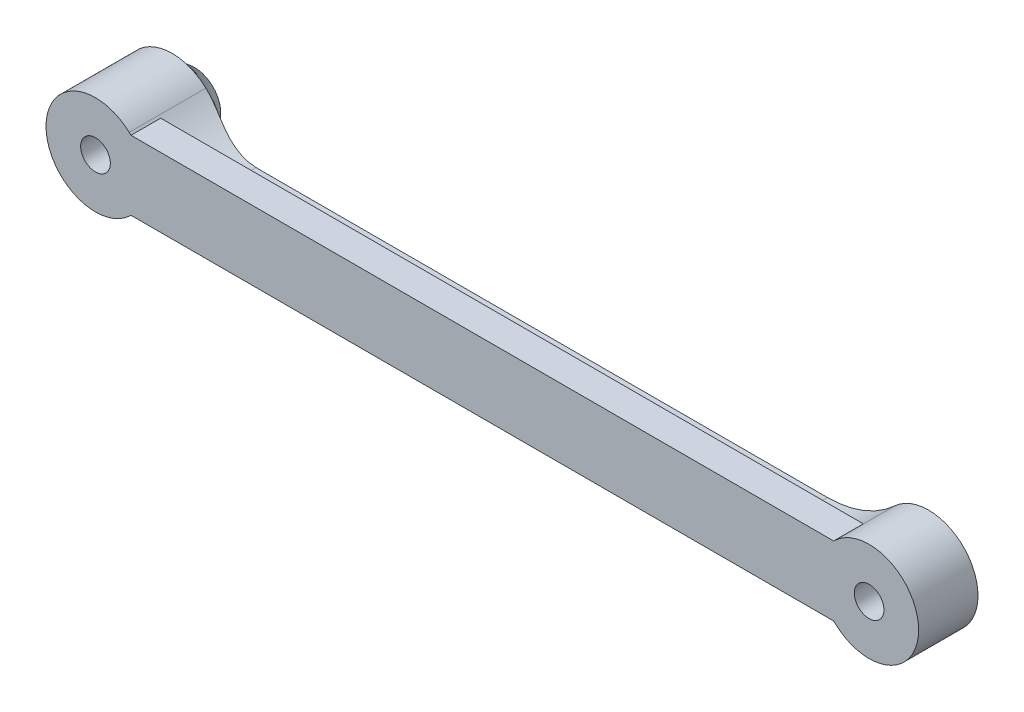
ISO-10303-21;
HEADER;
FILE_DESCRIPTION(('STEP AP214'),'2;1');
FILE_NAME('part.step','',(''),(''),'','','');
FILE_SCHEMA(('AUTOMOTIVE_DESIGN { 1 0 10303 214 1 1 1 1 }'));
ENDSEC;
DATA;
#1=APPLICATION_CONTEXT('core data for automotive mechanical design processes');
#2=APPLICATION_PROTOCOL_DEFINITION('international standard','automotive_design',2000,#1);
#3=PRODUCT_CONTEXT('',#1,'mechanical');
#4=PRODUCT('Part','Part','',(#3));
#5=PRODUCT_RELATED_PRODUCT_CATEGORY('part','',(#4));
#6=PRODUCT_DEFINITION_FORMATION('','',#4);
#7=PRODUCT_DEFINITION_CONTEXT('part definition',#1,'design');
#8=PRODUCT_DEFINITION('design','',#6,#7);
#9=PRODUCT_DEFINITION_SHAPE('','',#8);
#10=(LENGTH_UNIT() NAMED_UNIT(*) SI_UNIT(.MILLI.,.METRE.));
#11=(NAMED_UNIT(*) PLANE_ANGLE_UNIT() SI_UNIT($,.RADIAN.));
#12=(NAMED_UNIT(*) SI_UNIT($,.STERADIAN.) SOLID_ANGLE_UNIT());
#13=UNCERTAINTY_MEASURE_WITH_UNIT(LENGTH_MEASURE(1.E-05),#10,'distance_accuracy_value','');
#14=(GEOMETRIC_REPRESENTATION_CONTEXT(3) GLOBAL_UNCERTAINTY_ASSIGNED_CONTEXT((#13)) GLOBAL_UNIT_ASSIGNED_CONTEXT((#10,
#11,#12)) REPRESENTATION_CONTEXT('',''));
#15=CARTESIAN_POINT('',(0.,0.,0.));
#16=DIRECTION('',(0.,0.,1.));
#17=DIRECTION('',(1.,0.,0.));
#18=AXIS2_PLACEMENT_3D('',#15,#16,#17);
#19=CARTESIAN_POINT('',(78.1410447986133,0.,3.));
#20=DIRECTION('',(0.,0.,-1.));
#21=DIRECTION('',(-1.,0.,0.));
#22=AXIS2_PLACEMENT_3D('',#19,#20,#21);
#23=CYLINDRICAL_SURFACE('',#22,5.);
#24=CARTESIAN_POINT('',(78.1410447986133,0.,-3.));
#25=DIRECTION('',(0.,0.,1.));
#26=DIRECTION('',(1.,0.,0.));
#27=AXIS2_PLACEMENT_3D('',#24,#25,#26);
#28=CIRCLE('',#27,5.);
#29=CARTESIAN_POINT('',(74.7384821221305,-3.6636821959071,-3.));
#30=VERTEX_POINT('',#29);
#31=CARTESIAN_POINT('',(74.7384821221305,3.66368219590711,-3.));
#32=VERTEX_POINT('',#31);
#33=EDGE_CURVE('E190',#30,#32,#28,.T.);
#34=ORIENTED_EDGE('',*,*,#33,.T.);
#35=DIRECTION('',(0.,0.,-1.));
#36=VECTOR('',#35,1.);
#37=CARTESIAN_POINT('',(74.7384821221305,3.66368219590711,3.));
#38=LINE('',#37,#36);
#39=CARTESIAN_POINT('',(74.7384821221305,3.66368219590711,3.));
#40=VERTEX_POINT('',#39);
#41=EDGE_CURVE('E265',#32,#40,#38,.F.);
#42=ORIENTED_EDGE('',*,*,#41,.T.);
#43=CARTESIAN_POINT('',(78.1410447986133,0.,3.));
#44=DIRECTION('',(0.,0.,1.));
#45=DIRECTION('',(1.,0.,0.));
#46=AXIS2_PLACEMENT_3D('',#43,#44,#45);
#47=CIRCLE('',#46,5.);
#48=CARTESIAN_POINT('',(74.7384821221305,-3.6636821959071,3.));
#49=VERTEX_POINT('',#48);
#50=EDGE_CURVE('E198',#49,#40,#47,.T.);
#51=ORIENTED_EDGE('',*,*,#50,.F.);
#52=DIRECTION('',(0.,0.,-1.));
#53=VECTOR('',#52,1.);
#54=CARTESIAN_POINT('',(74.7384821221305,-3.6636821959071,3.));
#55=LINE('',#54,#53);
#56=EDGE_CURVE('E225',#49,#30,#55,.T.);
#57=ORIENTED_EDGE('',*,*,#56,.T.);
#58=EDGE_LOOP('',(#34,#42,#51,#57));
#59=FACE_BOUND('',#58,.T.);
#60=ADVANCED_FACE('F41',(#59),#23,.T.);
#61=CARTESIAN_POINT('',(0.,0.,3.));
#62=DIRECTION('',(0.,0.,-1.));
#63=DIRECTION('',(-1.,0.,0.));
#64=AXIS2_PLACEMENT_3D('',#61,#62,#63);
#65=CYLINDRICAL_SURFACE('',#64,5.);
#66=CARTESIAN_POINT('',(0.,0.,3.));
#67=DIRECTION('',(0.,0.,1.));
#68=DIRECTION('',(1.,0.,0.));
#69=AXIS2_PLACEMENT_3D('',#66,#67,#68);
#70=CIRCLE('',#69,5.);
#71=CARTESIAN_POINT('',(3.40256267648273,3.6636821959071,3.));
#72=VERTEX_POINT('',#71);
#73=CARTESIAN_POINT('',(3.40256267648274,-3.6636821959071,3.));
#74=VERTEX_POINT('',#73);
#75=EDGE_CURVE('E207',#72,#74,#70,.T.);
#76=ORIENTED_EDGE('',*,*,#75,.F.);
#77=DIRECTION('',(0.,0.,-1.));
#78=VECTOR('',#77,1.);
#79=CARTESIAN_POINT('',(3.40256267648273,3.6636821959071,3.));
#80=LINE('',#79,#78);
#81=CARTESIAN_POINT('',(3.40256267648273,3.6636821959071,-4.74722945743232));
#82=VERTEX_POINT('',#81);
#83=EDGE_CURVE('E255',#72,#82,#80,.T.);
#84=ORIENTED_EDGE('',*,*,#83,.T.);
#85=CARTESIAN_POINT('',(0.,0.,-4.74722945743232));
#86=DIRECTION('',(0.,0.,1.));
#87=DIRECTION('',(1.,0.,0.));
#88=AXIS2_PLACEMENT_3D('',#85,#86,#87);
#89=CIRCLE('',#88,5.);
#90=CARTESIAN_POINT('',(3.40256267648274,-3.6636821959071,-4.74722945743232));
#91=VERTEX_POINT('',#90);
#92=EDGE_CURVE('E362',#82,#91,#89,.T.);
#93=ORIENTED_EDGE('',*,*,#92,.T.);
#94=DIRECTION('',(0.,0.,-1.));
#95=VECTOR('',#94,1.);
#96=CARTESIAN_POINT('',(3.40256267648274,-3.6636821959071,3.));
#97=LINE('',#96,#95);
#98=EDGE_CURVE('E69',#91,#74,#97,.F.);
#99=ORIENTED_EDGE('',*,*,#98,.T.);
#100=EDGE_LOOP('',(#76,#84,#93,#99));
#101=FACE_BOUND('',#100,.T.);
#102=ADVANCED_FACE('F334',(#101),#65,.T.);
#103=CARTESIAN_POINT('',(0.,0.,0.));
#104=DIRECTION('',(0.,0.,1.));
#105=DIRECTION('',(1.,0.,0.));
#106=AXIS2_PLACEMENT_3D('',#103,#104,#105);
#107=PLANE('',#106);
#108=DIRECTION('',(1.,0.,0.));
#109=VECTOR('',#108,1.);
#110=CARTESIAN_POINT('',(0.,-3.5,0.));
#111=LINE('',#110,#109);
#112=CARTESIAN_POINT('',(3.5831713662803,-3.5,0.));
#113=VERTEX_POINT('',#112);
#114=CARTESIAN_POINT('',(74.557873432333,-3.5,0.));
#115=VERTEX_POINT('',#114);
#116=EDGE_CURVE('E194',#113,#115,#111,.T.);
#117=ORIENTED_EDGE('',*,*,#116,.F.);
#118=CARTESIAN_POINT('',(10.2076880294482,-10.9910465877213,0.));
#119=DIRECTION('',(0.,0.,1.));
#120=DIRECTION('',(1.,0.,0.));
#121=AXIS2_PLACEMENT_3D('',#118,#119,#120);
#122=CIRCLE('',#121,10.);
#123=CARTESIAN_POINT('',(10.2076880294482,-0.99104658772129,0.));
#124=VERTEX_POINT('',#123);
#125=EDGE_CURVE('E167',#113,#124,#122,.F.);
#126=ORIENTED_EDGE('',*,*,#125,.T.);
#127=DIRECTION('',(-1.,0.,0.));
#128=VECTOR('',#127,1.);
#129=CARTESIAN_POINT('',(0.,-0.99104658772129,0.));
#130=LINE('',#129,#128);
#131=CARTESIAN_POINT('',(67.933356769165,-0.99104658772129,0.));
#132=VERTEX_POINT('',#131);
#133=EDGE_CURVE('E159',#132,#124,#130,.T.);
#134=ORIENTED_EDGE('',*,*,#133,.F.);
#135=CARTESIAN_POINT('',(67.933356769165,-10.9910465877213,0.));
#136=DIRECTION('',(0.,0.,1.));
#137=DIRECTION('',(1.,0.,0.));
#138=AXIS2_PLACEMENT_3D('',#135,#136,#137);
#139=CIRCLE('',#138,10.);
#140=EDGE_CURVE('E144',#132,#115,#139,.F.);
#141=ORIENTED_EDGE('',*,*,#140,.T.);
#142=EDGE_LOOP('',(#117,#126,#134,#141));
#143=FACE_BOUND('',#142,.T.);
#144=ADVANCED_FACE('F165',(#143),#107,.F.);
#145=CARTESIAN_POINT('',(0.,0.,3.));
#146=DIRECTION('',(0.,0.,-1.));
#147=DIRECTION('',(-1.,0.,0.));
#148=AXIS2_PLACEMENT_3D('',#145,#146,#147);
#149=CYLINDRICAL_SURFACE('',#148,1.5);
#150=CARTESIAN_POINT('',(0.,0.,3.));
#151=DIRECTION('',(0.,0.,1.));
#152=DIRECTION('',(1.,0.,0.));
#153=AXIS2_PLACEMENT_3D('',#150,#151,#152);
#154=CIRCLE('',#153,1.5);
#155=CARTESIAN_POINT('',(1.5,0.,3.));
#156=VERTEX_POINT('',#155);
#157=EDGE_CURVE('E211',#156,#156,#154,.T.);
#158=ORIENTED_EDGE('',*,*,#157,.T.);
#159=EDGE_LOOP('',(#158));
#160=FACE_BOUND('',#159,.T.);
#161=CARTESIAN_POINT('',(0.,0.,-7.));
#162=DIRECTION('',(0.,0.,1.));
#163=DIRECTION('',(1.,0.,0.));
#164=AXIS2_PLACEMENT_3D('',#161,#162,#163);
#165=CIRCLE('',#164,1.5);
#166=CARTESIAN_POINT('',(1.5,0.,-7.));
#167=VERTEX_POINT('',#166);
#168=EDGE_CURVE('E178',#167,#167,#165,.T.);
#169=ORIENTED_EDGE('',*,*,#168,.F.);
#170=EDGE_LOOP('',(#169));
#171=FACE_BOUND('',#170,.T.);
#172=ADVANCED_FACE('F329',(#160,#171),#149,.F.);
#173=CARTESIAN_POINT('',(0.,-3.5,3.));
#174=DIRECTION('',(0.,1.,0.));
#175=DIRECTION('',(0.,0.,1.));
#176=AXIS2_PLACEMENT_3D('',#173,#174,#175);
#177=PLANE('',#176);
#178=DIRECTION('',(1.,0.,0.));
#179=VECTOR('',#178,1.);
#180=CARTESIAN_POINT('',(0.,-3.5,3.));
#181=LINE('',#180,#179);
#182=CARTESIAN_POINT('',(3.5831713662803,-3.5,3.));
#183=VERTEX_POINT('',#182);
#184=CARTESIAN_POINT('',(74.557873432333,-3.5,3.));
#185=VERTEX_POINT('',#184);
#186=EDGE_CURVE('E195',#183,#185,#181,.T.);
#187=ORIENTED_EDGE('',*,*,#186,.F.);
#188=DIRECTION('',(0.,0.,-1.));
#189=VECTOR('',#188,1.);
#190=CARTESIAN_POINT('',(3.5831713662803,-3.5,3.));
#191=LINE('',#190,#189);
#192=EDGE_CURVE('E258',#183,#113,#191,.T.);
#193=ORIENTED_EDGE('',*,*,#192,.T.);
#194=ORIENTED_EDGE('',*,*,#116,.T.);
#195=DIRECTION('',(0.,0.,-1.));
#196=VECTOR('',#195,1.);
#197=CARTESIAN_POINT('',(74.557873432333,-3.5,0.));
#198=LINE('',#197,#196);
#199=EDGE_CURVE('E151',#115,#185,#198,.F.);
#200=ORIENTED_EDGE('',*,*,#199,.T.);
#201=EDGE_LOOP('',(#187,#193,#194,#200));
#202=FACE_BOUND('',#201,.T.);
#203=ADVANCED_FACE('F332',(#202),#177,.F.);
#204=CARTESIAN_POINT('',(0.,3.5,3.));
#205=DIRECTION('',(0.,1.,0.));
#206=DIRECTION('',(0.,0.,1.));
#207=AXIS2_PLACEMENT_3D('',#204,#205,#206);
#208=PLANE('',#207);
#209=DIRECTION('',(1.,0.,0.));
#210=VECTOR('',#209,1.);
#211=CARTESIAN_POINT('',(0.,3.5,0.));
#212=LINE('',#211,#210);
#213=CARTESIAN_POINT('',(3.5831713662803,3.5,0.));
#214=VERTEX_POINT('',#213);
#215=CARTESIAN_POINT('',(74.557873432333,3.5,0.));
#216=VERTEX_POINT('',#215);
#217=EDGE_CURVE('E199',#214,#216,#212,.T.);
#218=ORIENTED_EDGE('',*,*,#217,.F.);
#219=DIRECTION('',(0.,0.,-1.));
#220=VECTOR('',#219,1.);
#221=CARTESIAN_POINT('',(3.5831713662803,3.5,0.));
#222=LINE('',#221,#220);
#223=CARTESIAN_POINT('',(3.5831713662803,3.5,3.));
#224=VERTEX_POINT('',#223);
#225=EDGE_CURVE('E250',#214,#224,#222,.F.);
#226=ORIENTED_EDGE('',*,*,#225,.T.);
#227=DIRECTION('',(1.,0.,0.));
#228=VECTOR('',#227,1.);
#229=CARTESIAN_POINT('',(0.,3.5,3.));
#230=LINE('',#229,#228);
#231=CARTESIAN_POINT('',(74.557873432333,3.5,3.));
#232=VERTEX_POINT('',#231);
#233=EDGE_CURVE('E203',#224,#232,#230,.T.);
#234=ORIENTED_EDGE('',*,*,#233,.T.);
#235=DIRECTION('',(0.,0.,-1.));
#236=VECTOR('',#235,1.);
#237=CARTESIAN_POINT('',(74.557873432333,3.5,3.));
#238=LINE('',#237,#236);
#239=EDGE_CURVE('E247',#232,#216,#238,.T.);
#240=ORIENTED_EDGE('',*,*,#239,.T.);
#241=EDGE_LOOP('',(#218,#226,#234,#240));
#242=FACE_BOUND('',#241,.T.);
#243=ADVANCED_FACE('F327',(#242),#208,.T.);
#244=CARTESIAN_POINT('',(78.1410447986133,0.,3.));
#245=DIRECTION('',(0.,0.,-1.));
#246=DIRECTION('',(-1.,0.,0.));
#247=AXIS2_PLACEMENT_3D('',#244,#245,#246);
#248=CYLINDRICAL_SURFACE('',#247,1.5);
#249=CARTESIAN_POINT('',(78.1410447986133,0.,3.));
#250=DIRECTION('',(0.,0.,1.));
#251=DIRECTION('',(1.,0.,0.));
#252=AXIS2_PLACEMENT_3D('',#249,#250,#251);
#253=CIRCLE('',#252,1.5);
#254=CARTESIAN_POINT('',(79.6410447986133,0.,3.));
#255=VERTEX_POINT('',#254);
#256=EDGE_CURVE('E163',#255,#255,#253,.T.);
#257=ORIENTED_EDGE('',*,*,#256,.T.);
#258=EDGE_LOOP('',(#257));
#259=FACE_BOUND('',#258,.T.);
#260=CARTESIAN_POINT('',(78.1410447986133,0.,-3.));
#261=DIRECTION('',(0.,0.,1.));
#262=DIRECTION('',(1.,0.,0.));
#263=AXIS2_PLACEMENT_3D('',#260,#261,#262);
#264=CIRCLE('',#263,1.5);
#265=CARTESIAN_POINT('',(79.6410447986133,0.,-3.));
#266=VERTEX_POINT('',#265);
#267=EDGE_CURVE('E186',#266,#266,#264,.T.);
#268=ORIENTED_EDGE('',*,*,#267,.F.);
#269=EDGE_LOOP('',(#268));
#270=FACE_BOUND('',#269,.T.);
#271=ADVANCED_FACE('F320',(#259,#270),#248,.F.);
#272=CARTESIAN_POINT('',(0.,0.,3.));
#273=DIRECTION('',(0.,0.,1.));
#274=DIRECTION('',(1.,0.,0.));
#275=AXIS2_PLACEMENT_3D('',#272,#273,#274);
#276=PLANE('',#275);
#277=ORIENTED_EDGE('',*,*,#75,.T.);
#278=CARTESIAN_POINT('',(10.2076880294482,-10.9910465877213,3.));
#279=DIRECTION('',(0.,0.,1.));
#280=DIRECTION('',(1.,0.,0.));
#281=AXIS2_PLACEMENT_3D('',#278,#279,#280);
#282=CIRCLE('',#281,10.);
#283=EDGE_CURVE('E272',#74,#183,#282,.F.);
#284=ORIENTED_EDGE('',*,*,#283,.T.);
#285=ORIENTED_EDGE('',*,*,#186,.T.);
#286=CARTESIAN_POINT('',(67.933356769165,-10.9910465877213,3.));
#287=DIRECTION('',(0.,0.,1.));
#288=DIRECTION('',(1.,0.,0.));
#289=AXIS2_PLACEMENT_3D('',#286,#287,#288);
#290=CIRCLE('',#289,10.);
#291=EDGE_CURVE('E228',#185,#49,#290,.F.);
#292=ORIENTED_EDGE('',*,*,#291,.T.);
#293=ORIENTED_EDGE('',*,*,#50,.T.);
#294=CARTESIAN_POINT('',(67.9333567691651,10.9910465877213,3.));
#295=DIRECTION('',(0.,0.,1.));
#296=DIRECTION('',(1.,0.,0.));
#297=AXIS2_PLACEMENT_3D('',#294,#295,#296);
#298=CIRCLE('',#297,10.);
#299=EDGE_CURVE('E275',#40,#232,#298,.F.);
#300=ORIENTED_EDGE('',*,*,#299,.T.);
#301=ORIENTED_EDGE('',*,*,#233,.F.);
#302=CARTESIAN_POINT('',(10.2076880294482,10.9910465877213,3.));
#303=DIRECTION('',(0.,0.,1.));
#304=DIRECTION('',(1.,0.,0.));
#305=AXIS2_PLACEMENT_3D('',#302,#303,#304);
#306=CIRCLE('',#305,10.);
#307=EDGE_CURVE('E269',#224,#72,#306,.F.);
#308=ORIENTED_EDGE('',*,*,#307,.T.);
#309=EDGE_LOOP('',(#277,#284,#285,#292,#293,#300,#301,#308));
#310=FACE_BOUND('',#309,.T.);
#311=ORIENTED_EDGE('',*,*,#157,.F.);
#312=EDGE_LOOP('',(#311));
#313=FACE_BOUND('',#312,.T.);
#314=ORIENTED_EDGE('',*,*,#256,.F.);
#315=EDGE_LOOP('',(#314));
#316=FACE_BOUND('',#315,.T.);
#317=ADVANCED_FACE('F317',(#310,#313,#316),#276,.T.);
#318=DIRECTION('',(-1.,0.,0.));
#319=VECTOR('',#318,1.);
#320=CARTESIAN_POINT('',(0.,0.991046587721304,0.));
#321=LINE('',#320,#319);
#322=CARTESIAN_POINT('',(67.9333567691651,0.991046587721304,0.));
#323=VERTEX_POINT('',#322);
#324=CARTESIAN_POINT('',(10.2076880294482,0.991046587721304,0.));
#325=VERTEX_POINT('',#324);
#326=EDGE_CURVE('E169',#323,#325,#321,.T.);
#327=ORIENTED_EDGE('',*,*,#326,.T.);
#328=CARTESIAN_POINT('',(10.2076880294482,10.9910465877213,0.));
#329=DIRECTION('',(0.,0.,1.));
#330=DIRECTION('',(1.,0.,0.));
#331=AXIS2_PLACEMENT_3D('',#328,#329,#330);
#332=CIRCLE('',#331,10.);
#333=EDGE_CURVE('E244',#325,#214,#332,.F.);
#334=ORIENTED_EDGE('',*,*,#333,.T.);
#335=ORIENTED_EDGE('',*,*,#217,.T.);
#336=CARTESIAN_POINT('',(67.9333567691651,10.9910465877213,0.));
#337=DIRECTION('',(0.,0.,1.));
#338=DIRECTION('',(1.,0.,0.));
#339=AXIS2_PLACEMENT_3D('',#336,#337,#338);
#340=CIRCLE('',#339,10.);
#341=EDGE_CURVE('E241',#216,#323,#340,.F.);
#342=ORIENTED_EDGE('',*,*,#341,.T.);
#343=EDGE_LOOP('',(#327,#334,#335,#342));
#344=FACE_BOUND('',#343,.T.);
#345=ADVANCED_FACE('F315',(#344),#107,.F.);
#346=CARTESIAN_POINT('',(0.,0.,-3.));
#347=DIRECTION('',(0.,0.,1.));
#348=DIRECTION('',(1.,0.,0.));
#349=AXIS2_PLACEMENT_3D('',#346,#347,#348);
#350=PLANE('',#349);
#351=ORIENTED_EDGE('',*,*,#267,.T.);
#352=EDGE_LOOP('',(#351));
#353=FACE_BOUND('',#352,.T.);
#354=DIRECTION('',(-1.,0.,0.));
#355=VECTOR('',#354,1.);
#356=CARTESIAN_POINT('',(0.,-0.99104658772129,-3.));
#357=LINE('',#356,#355);
#358=CARTESIAN_POINT('',(67.933356769165,-0.99104658772129,-3.));
#359=VERTEX_POINT('',#358);
#360=CARTESIAN_POINT('',(10.6010570796856,-0.99104658772129,-3.));
#361=VERTEX_POINT('',#360);
#362=EDGE_CURVE('E161',#359,#361,#357,.T.);
#363=ORIENTED_EDGE('',*,*,#362,.T.);
#364=CARTESIAN_POINT('',(0.,0.,-3.));
#365=DIRECTION('',(0.,0.,1.));
#366=DIRECTION('',(1.,0.,0.));
#367=AXIS2_PLACEMENT_3D('',#364,#365,#366);
#368=CIRCLE('',#367,10.6472806174059);
#369=CARTESIAN_POINT('',(10.6010570796856,0.991046587721304,-3.));
#370=VERTEX_POINT('',#369);
#371=EDGE_CURVE('E281',#361,#370,#368,.T.);
#372=ORIENTED_EDGE('',*,*,#371,.T.);
#373=DIRECTION('',(-1.,0.,0.));
#374=VECTOR('',#373,1.);
#375=CARTESIAN_POINT('',(0.,0.991046587721304,-3.));
#376=LINE('',#375,#374);
#377=CARTESIAN_POINT('',(67.9333567691651,0.991046587721304,-3.));
#378=VERTEX_POINT('',#377);
#379=EDGE_CURVE('E175',#378,#370,#376,.T.);
#380=ORIENTED_EDGE('',*,*,#379,.F.);
#381=CARTESIAN_POINT('',(67.9333567691651,10.9910465877213,-3.));
#382=DIRECTION('',(0.,0.,1.));
#383=DIRECTION('',(1.,0.,0.));
#384=AXIS2_PLACEMENT_3D('',#381,#382,#383);
#385=CIRCLE('',#384,10.);
#386=EDGE_CURVE('E278',#378,#32,#385,.T.);
#387=ORIENTED_EDGE('',*,*,#386,.T.);
#388=ORIENTED_EDGE('',*,*,#33,.F.);
#389=CARTESIAN_POINT('',(67.933356769165,-10.9910465877213,-3.));
#390=DIRECTION('',(0.,0.,1.));
#391=DIRECTION('',(1.,0.,0.));
#392=AXIS2_PLACEMENT_3D('',#389,#390,#391);
#393=CIRCLE('',#392,10.);
#394=EDGE_CURVE('E231',#30,#359,#393,.T.);
#395=ORIENTED_EDGE('',*,*,#394,.T.);
#396=EDGE_LOOP('',(#363,#372,#380,#387,#388,#395));
#397=FACE_BOUND('',#396,.T.);
#398=ADVANCED_FACE('F311',(#353,#397),#350,.F.);
#399=CARTESIAN_POINT('',(0.,0.,-7.));
#400=DIRECTION('',(0.,0.,-1.));
#401=DIRECTION('',(-1.,0.,0.));
#402=AXIS2_PLACEMENT_3D('',#399,#400,#401);
#403=PLANE('',#402);
#404=ORIENTED_EDGE('',*,*,#168,.T.);
#405=EDGE_LOOP('',(#404));
#406=FACE_BOUND('',#405,.T.);
#407=CARTESIAN_POINT('',(0.,0.,-7.));
#408=DIRECTION('',(0.,0.,-1.));
#409=DIRECTION('',(-1.,0.,0.));
#410=AXIS2_PLACEMENT_3D('',#407,#408,#409);
#411=CIRCLE('',#410,2.64728061740587);
#412=CARTESIAN_POINT('',(-2.64728061740587,0.,-7.));
#413=VERTEX_POINT('',#412);
#414=EDGE_CURVE('E182',#413,#413,#411,.T.);
#415=ORIENTED_EDGE('',*,*,#414,.T.);
#416=EDGE_LOOP('',(#415));
#417=FACE_BOUND('',#416,.T.);
#418=ADVANCED_FACE('F308',(#406,#417),#403,.T.);
#419=CARTESIAN_POINT('',(0.,-0.99104658772129,-3.));
#420=DIRECTION('',(0.,1.,0.));
#421=DIRECTION('',(0.,0.,1.));
#422=AXIS2_PLACEMENT_3D('',#419,#420,#421);
#423=PLANE('',#422);
#424=ORIENTED_EDGE('',*,*,#133,.T.);
#425=DIRECTION('',(0.,0.,1.));
#426=VECTOR('',#425,1.);
#427=CARTESIAN_POINT('',(10.2076880294482,-0.991046587721291,-3.));
#428=LINE('',#427,#426);
#429=CARTESIAN_POINT('',(10.2076880294482,-0.991046587721291,-3.007670310612));
#430=VERTEX_POINT('',#429);
#431=EDGE_CURVE('E62',#124,#430,#428,.F.);
#432=ORIENTED_EDGE('',*,*,#431,.T.);
#433=CARTESIAN_POINT('',(10.2076880294482,-0.99104658772129,-3.007670310612));
#434=CARTESIAN_POINT('',(10.2732246160287,-0.99104658772129,-3.00511387593267));
#435=CARTESIAN_POINT('',(10.3387736629659,-0.99104658772129,-3.00319646604201));
#436=CARTESIAN_POINT('',(10.4698966797109,-0.99104658772129,-3.00063969579595));
#437=CARTESIAN_POINT('',(10.5354706495195,-0.99104658772129,-3.00000033548261));
#438=CARTESIAN_POINT('',(10.6010570796856,-0.99104658772129,-3.));
#439=B_SPLINE_CURVE_WITH_KNOTS('',3,(#433,#434,#435,#436,#437,#438),.UNSPECIFIED.,.F.,.F.,(4,2,
4),(0.,0.196731253580948,0.39346251363557),.UNSPECIFIED.);
#440=EDGE_CURVE('E11',#430,#361,#439,.T.);
#441=ORIENTED_EDGE('',*,*,#440,.T.);
#442=ORIENTED_EDGE('',*,*,#362,.F.);
#443=DIRECTION('',(0.,0.,1.));
#444=VECTOR('',#443,1.);
#445=CARTESIAN_POINT('',(67.933356769165,-0.991046587721291,0.));
#446=LINE('',#445,#444);
#447=EDGE_CURVE('E148',#359,#132,#446,.T.);
#448=ORIENTED_EDGE('',*,*,#447,.T.);
#449=EDGE_LOOP('',(#424,#432,#441,#442,#448));
#450=FACE_BOUND('',#449,.T.);
#451=ADVANCED_FACE('F158',(#450),#423,.F.);
#452=CARTESIAN_POINT('',(0.,0.991046587721304,-3.));
#453=DIRECTION('',(0.,1.,0.));
#454=DIRECTION('',(0.,0.,1.));
#455=AXIS2_PLACEMENT_3D('',#452,#453,#454);
#456=PLANE('',#455);
#457=ORIENTED_EDGE('',*,*,#379,.T.);
#458=CARTESIAN_POINT('',(10.6010570796856,0.991046587721304,-3.));
#459=CARTESIAN_POINT('',(10.5354706495195,0.991046587721304,-3.00000033548261));
#460=CARTESIAN_POINT('',(10.4698966797109,0.991046587721304,-3.00063969579595));
#461=CARTESIAN_POINT('',(10.3387736629659,0.991046587721304,-3.003196466042));
#462=CARTESIAN_POINT('',(10.2732246160287,0.991046587721304,-3.00511387593267));
#463=CARTESIAN_POINT('',(10.2076880294482,0.991046587721304,-3.007670310612));
#464=B_SPLINE_CURVE_WITH_KNOTS('',3,(#458,#459,#460,#461,#462,#463),.UNSPECIFIED.,.F.,.F.,(4,2,
4),(0.,0.196731260054629,0.393462513635584),.UNSPECIFIED.);
#465=CARTESIAN_POINT('',(10.2076880294482,0.991046587721304,-3.007670310612));
#466=VERTEX_POINT('',#465);
#467=EDGE_CURVE('E285',#370,#466,#464,.T.);
#468=ORIENTED_EDGE('',*,*,#467,.T.);
#469=DIRECTION('',(0.,0.,-1.));
#470=VECTOR('',#469,1.);
#471=CARTESIAN_POINT('',(10.2076880294482,0.991046587721304,-3.));
#472=LINE('',#471,#470);
#473=EDGE_CURVE('E237',#466,#325,#472,.F.);
#474=ORIENTED_EDGE('',*,*,#473,.T.);
#475=ORIENTED_EDGE('',*,*,#326,.F.);
#476=DIRECTION('',(0.,0.,-1.));
#477=VECTOR('',#476,1.);
#478=CARTESIAN_POINT('',(67.9333567691651,0.991046587721304,-3.));
#479=LINE('',#478,#477);
#480=EDGE_CURVE('E234',#323,#378,#479,.T.);
#481=ORIENTED_EDGE('',*,*,#480,.T.);
#482=EDGE_LOOP('',(#457,#468,#474,#475,#481));
#483=FACE_BOUND('',#482,.T.);
#484=ADVANCED_FACE('F301',(#483),#456,.T.);
#485=CARTESIAN_POINT('',(67.933356769165,-10.9910465877213,3.));
#486=DIRECTION('',(0.,0.,-1.));
#487=DIRECTION('',(-1.,0.,0.));
#488=AXIS2_PLACEMENT_3D('',#485,#486,#487);
#489=CYLINDRICAL_SURFACE('',#488,10.);
#490=ORIENTED_EDGE('',*,*,#394,.F.);
#491=ORIENTED_EDGE('',*,*,#56,.F.);
#492=ORIENTED_EDGE('',*,*,#291,.F.);
#493=ORIENTED_EDGE('',*,*,#199,.F.);
#494=ORIENTED_EDGE('',*,*,#140,.F.);
#495=ORIENTED_EDGE('',*,*,#447,.F.);
#496=EDGE_LOOP('',(#490,#491,#492,#493,#494,#495));
#497=FACE_BOUND('',#496,.T.);
#498=ADVANCED_FACE('F147',(#497),#489,.F.);
#499=CARTESIAN_POINT('',(10.2076880294482,10.9910465877213,3.));
#500=DIRECTION('',(0.,0.,-1.));
#501=DIRECTION('',(-1.,0.,0.));
#502=AXIS2_PLACEMENT_3D('',#499,#500,#501);
#503=CYLINDRICAL_SURFACE('',#502,10.);
#504=ORIENTED_EDGE('',*,*,#473,.F.);
#505=CARTESIAN_POINT('',(10.2076880294482,0.991046587721304,-3.007670310612));
#506=CARTESIAN_POINT('',(10.0981084204546,0.991045175805535,-3.01194243496076));
#507=CARTESIAN_POINT('',(9.98861544143548,0.99284818330331,-3.01799712372827));
#508=CARTESIAN_POINT('',(9.77000682599476,1.00003103915817,-3.03359965807703));
#509=CARTESIAN_POINT('',(9.66089115309956,1.00541053148096,-3.04314715591124));
#510=CARTESIAN_POINT('',(9.33467251593995,1.02684729505935,-3.07689284098615));
#511=CARTESIAN_POINT('',(9.118405883173,1.04820303066416,-3.10620595698838));
#512=CARTESIAN_POINT('',(8.69165915830407,1.10430726374134,-3.1771843051653));
#513=CARTESIAN_POINT('',(8.48114549956253,1.13894033864848,-3.21874238804989));
#514=CARTESIAN_POINT('',(8.06511611777705,1.22097269679975,-3.31293041436035));
#515=CARTESIAN_POINT('',(7.8596012220569,1.26837407780589,-3.36556217681915));
#516=CARTESIAN_POINT('',(7.51927579492652,1.35814730500324,-3.46171268551587));
#517=CARTESIAN_POINT('',(7.38288530912777,1.39727440265995,-3.50275781488211));
#518=CARTESIAN_POINT('',(7.11289034348996,1.48093615615799,-3.58840105644679));
#519=CARTESIAN_POINT('',(6.97928613403262,1.52547133396747,-3.63299951145616));
#520=CARTESIAN_POINT('',(6.71478364654475,1.61984818065127,-3.72496048559476));
#521=CARTESIAN_POINT('',(6.58388809779796,1.66969491762076,-3.77232562477113));
#522=CARTESIAN_POINT('',(6.32486272680721,1.77458345693423,-3.86880017380656));
#523=CARTESIAN_POINT('',(6.19673278998316,1.8296250435445,-3.91790951117911));
#524=CARTESIAN_POINT('',(5.94362195709089,1.94466698422254,-4.01649705924554));
#525=CARTESIAN_POINT('',(5.81862979698942,2.00464475219379,-4.06597273988448));
#526=CARTESIAN_POINT('',(5.5709773206361,2.1298857039223,-4.16413161713966));
#527=CARTESIAN_POINT('',(5.44831730774351,2.19514956955092,-4.21281471054157));
#528=CARTESIAN_POINT('',(5.20524560113045,2.33108487444089,-4.30765521211987));
#529=CARTESIAN_POINT('',(5.0848312839044,2.40174943859302,-4.35381570723297));
#530=CARTESIAN_POINT('',(4.8459227767514,2.54882291341148,-4.44166095648153));
#531=CARTESIAN_POINT('',(4.72742791216826,2.62522975006493,-4.48334731351726));
#532=CARTESIAN_POINT('',(4.5059004079131,2.77488281795936,-4.55547952389979));
#533=CARTESIAN_POINT('',(4.40266755467514,2.84746883601971,-4.58666820500862));
#534=CARTESIAN_POINT('',(4.19786082928019,2.99741967353105,-4.6419573328975));
#535=CARTESIAN_POINT('',(4.09628588642886,3.07478124090132,-4.66606254037043));
#536=CARTESIAN_POINT('',(3.89448325315839,3.23475173134783,-4.70566352346211));
#537=CARTESIAN_POINT('',(3.79426804932322,3.31739058920196,-4.72110421363225));
#538=CARTESIAN_POINT('',(3.64587141686386,3.44473406830073,-4.73669992993157));
#539=CARTESIAN_POINT('',(3.59666281037579,3.48780557814079,-4.74063779485536));
#540=CARTESIAN_POINT('',(3.49901267579109,3.57498544692301,-4.74590664585354));
#541=CARTESIAN_POINT('',(3.45057131164141,3.61909402259678,-4.74723708202371));
#542=CARTESIAN_POINT('',(3.40256267648274,3.66368219590709,-4.74722945743238));
#543=B_SPLINE_CURVE_WITH_KNOTS('',3,(#505,#506,#507,#508,#509,#510,#511,#512,#513,#514,#515,
#516,#517,#518,#519,#520,#521,#522,#523,#524,#525,#526,#527,#528,#529,#530,#531,#532,#533,#534,
#535,#536,#537,#538,#539,#540,#541,#542),.UNSPECIFIED.,.F.,.F.,(4,2,2,2,2,2,2,2,2,2,2,2,2,2,2,2,
2,2,4),(0.,0.32892656692282,0.657820394546705,1.31473447312299,1.96606281750428,
2.61749823686422,3.06046664469383,3.50347784024922,3.94691559150557,4.39033493560598,
4.83182753128177,5.27337716753661,5.7143737834682,6.15521187728052,6.54495172131687,
6.93442902499479,7.32635519793816,7.52284107736067,7.71936839100889),.UNSPECIFIED.);
#544=EDGE_CURVE('E294',#466,#82,#543,.T.);
#545=ORIENTED_EDGE('',*,*,#544,.T.);
#546=ORIENTED_EDGE('',*,*,#83,.F.);
#547=ORIENTED_EDGE('',*,*,#307,.F.);
#548=ORIENTED_EDGE('',*,*,#225,.F.);
#549=ORIENTED_EDGE('',*,*,#333,.F.);
#550=EDGE_LOOP('',(#504,#545,#546,#547,#548,#549));
#551=FACE_BOUND('',#550,.T.);
#552=ADVANCED_FACE('F348',(#551),#503,.F.);
#553=CARTESIAN_POINT('',(10.2076880294482,-10.9910465877213,3.));
#554=DIRECTION('',(0.,0.,-1.));
#555=DIRECTION('',(-1.,0.,0.));
#556=AXIS2_PLACEMENT_3D('',#553,#554,#555);
#557=CYLINDRICAL_SURFACE('',#556,10.);
#558=ORIENTED_EDGE('',*,*,#98,.F.);
#559=CARTESIAN_POINT('',(3.40256267648274,-3.6636821959071,-4.74722945743232));
#560=CARTESIAN_POINT('',(3.44526323717264,-3.6240242585426,-4.74723414686693));
#561=CARTESIAN_POINT('',(3.48830658520172,-3.58474483021615,-4.74618308709055));
#562=CARTESIAN_POINT('',(3.57501132810033,-3.50699766845625,-4.74201189022148));
#563=CARTESIAN_POINT('',(3.61867263868437,-3.46852982607756,-4.73889203268601));
#564=CARTESIAN_POINT('',(3.75034015009685,-3.3545478670223,-4.72650745118649));
#565=CARTESIAN_POINT('',(3.83918540810036,-3.28031098620423,-4.71421741506491));
#566=CARTESIAN_POINT('',(4.01763926886226,-3.13634649394573,-4.68253958993053));
#567=CARTESIAN_POINT('',(4.10723027814237,-3.06657996430455,-4.66322707401935));
#568=CARTESIAN_POINT('',(4.2877804803403,-2.93080745681455,-4.61858517146775));
#569=CARTESIAN_POINT('',(4.37874021779516,-2.86480302851571,-4.5932533274507));
#570=CARTESIAN_POINT('',(4.67207761086427,-2.65931341368021,-4.50443018332936));
#571=CARTESIAN_POINT('',(4.87673784510514,-2.52704474631441,-4.43171802207062));
#572=CARTESIAN_POINT('',(5.18800689494612,-2.3413405651662,-4.3143096611158));
#573=CARTESIAN_POINT('',(5.29256199978213,-2.28151273609452,-4.27374760818307));
#574=CARTESIAN_POINT('',(5.50328152897607,-2.16591209625559,-4.19103128446194));
#575=CARTESIAN_POINT('',(5.60944579955468,-2.11013890092478,-4.14887716525156));
#576=CARTESIAN_POINT('',(5.82438011443684,-2.00209815021032,-4.06370230846272));
#577=CARTESIAN_POINT('',(5.93316413241059,-1.94986183537726,-4.02067735246689));
#578=CARTESIAN_POINT('',(6.15266984309811,-1.8493072440628,-3.9349884555717));
#579=CARTESIAN_POINT('',(6.2633916521402,-1.80098920378864,-3.89232453657555));
#580=CARTESIAN_POINT('',(6.59847047722705,-1.66195064561057,-3.76613958031641));
#581=CARTESIAN_POINT('',(6.82594848274705,-1.57704123284299,-3.68433970156454));
#582=CARTESIAN_POINT('',(7.25988061544503,-1.4330247760181,-3.5401751875232));
#583=CARTESIAN_POINT('',(7.46531893555347,-1.37200841698473,-3.47666225698199));
#584=CARTESIAN_POINT('',(7.88241285417266,-1.26275983858582,-3.35943628402656));
#585=CARTESIAN_POINT('',(8.09406993709118,-1.21453069950246,-3.30572560382184));
#586=CARTESIAN_POINT('',(8.5216628799364,-1.1318116041855,-3.21033271952174));
#587=CARTESIAN_POINT('',(8.73757418867279,-1.09725863703758,-3.168595599901));
#588=CARTESIAN_POINT('',(9.17321698459231,-1.04227788283657,-3.09829410831441));
#589=CARTESIAN_POINT('',(9.39294572055635,-1.02184032313483,-3.06972062721947));
#590=CARTESIAN_POINT('',(9.71238168841403,-1.0028307304729,-3.03860207391876));
#591=CARTESIAN_POINT('',(9.81124173974834,-0.998417196016267,-3.03040240972785));
#592=CARTESIAN_POINT('',(10.0092731890524,-0.992524430907952,-3.01687122623439));
#593=CARTESIAN_POINT('',(10.1084446676169,-0.991046035635324,-3.01154052379051));
#594=CARTESIAN_POINT('',(10.2076880294482,-0.99104658772129,-3.007670310612));
#595=B_SPLINE_CURVE_WITH_KNOTS('',3,(#559,#560,#561,#562,#563,#564,#565,#566,#567,#568,#569,
#570,#571,#572,#573,#574,#575,#576,#577,#578,#579,#580,#581,#582,#583,#584,#585,#586,#587,#588,
#589,#590,#591,#592,#593,#594),.UNSPECIFIED.,.F.,.F.,(4,2,2,2,2,2,2,2,2,2,2,2,2,2,2,2,2,4),(0.,
0.174804043886794,0.349584471267384,0.698510694152696,1.04380204960458,1.3892346123688,
2.15059335077099,2.53188526276246,2.91314096364284,3.29741424905396,3.68171068260154,
4.44956209482295,5.11954542639109,5.78969000227695,6.45671000774592,7.12326774499736,
7.42108878108014,7.71899456878643),.UNSPECIFIED.);
#596=EDGE_CURVE('E56',#91,#430,#595,.T.);
#597=ORIENTED_EDGE('',*,*,#596,.T.);
#598=ORIENTED_EDGE('',*,*,#431,.F.);
#599=ORIENTED_EDGE('',*,*,#125,.F.);
#600=ORIENTED_EDGE('',*,*,#192,.F.);
#601=ORIENTED_EDGE('',*,*,#283,.F.);
#602=EDGE_LOOP('',(#558,#597,#598,#599,#600,#601));
#603=FACE_BOUND('',#602,.T.);
#604=ADVANCED_FACE('F352',(#603),#557,.F.);
#605=CARTESIAN_POINT('',(67.9333567691651,10.9910465877213,3.));
#606=DIRECTION('',(0.,0.,-1.));
#607=DIRECTION('',(-1.,0.,0.));
#608=AXIS2_PLACEMENT_3D('',#605,#606,#607);
#609=CYLINDRICAL_SURFACE('',#608,10.);
#610=ORIENTED_EDGE('',*,*,#386,.F.);
#611=ORIENTED_EDGE('',*,*,#480,.F.);
#612=ORIENTED_EDGE('',*,*,#341,.F.);
#613=ORIENTED_EDGE('',*,*,#239,.F.);
#614=ORIENTED_EDGE('',*,*,#299,.F.);
#615=ORIENTED_EDGE('',*,*,#41,.F.);
#616=EDGE_LOOP('',(#610,#611,#612,#613,#614,#615));
#617=FACE_BOUND('',#616,.T.);
#618=ADVANCED_FACE('F356',(#617),#609,.F.);
#619=CARTESIAN_POINT('',(0.,0.,-13.));
#620=DIRECTION('',(0.,0.,1.));
#621=DIRECTION('',(1.,0.,0.));
#622=AXIS2_PLACEMENT_3D('',#619,#620,#621);
#623=TOROIDAL_SURFACE('',#622,10.6472806174059,10.);
#624=ORIENTED_EDGE('',*,*,#467,.F.);
#625=ORIENTED_EDGE('',*,*,#371,.F.);
#626=ORIENTED_EDGE('',*,*,#440,.F.);
#627=ORIENTED_EDGE('',*,*,#596,.F.);
#628=ORIENTED_EDGE('',*,*,#92,.F.);
#629=ORIENTED_EDGE('',*,*,#544,.F.);
#630=EDGE_LOOP('',(#624,#625,#626,#627,#628,#629));
#631=FACE_BOUND('',#630,.T.);
#632=ORIENTED_EDGE('',*,*,#414,.F.);
#633=EDGE_LOOP('',(#632));
#634=FACE_BOUND('',#633,.T.);
#635=ADVANCED_FACE('F43',(#631,#634),#623,.F.);
#636=CLOSED_SHELL('',(#60,#102,#144,#172,#203,#243,#271,#317,#345,#398,#418,#451,#484,#498,#552,
#604,#618,#635));
#637=MANIFOLD_SOLID_BREP('B2',#636);
#638=ADVANCED_BREP_SHAPE_REPRESENTATION('',(#18,#637),#14);
#639=SHAPE_DEFINITION_REPRESENTATION(#9,#638);
ENDSEC;
END-ISO-10303-21;
